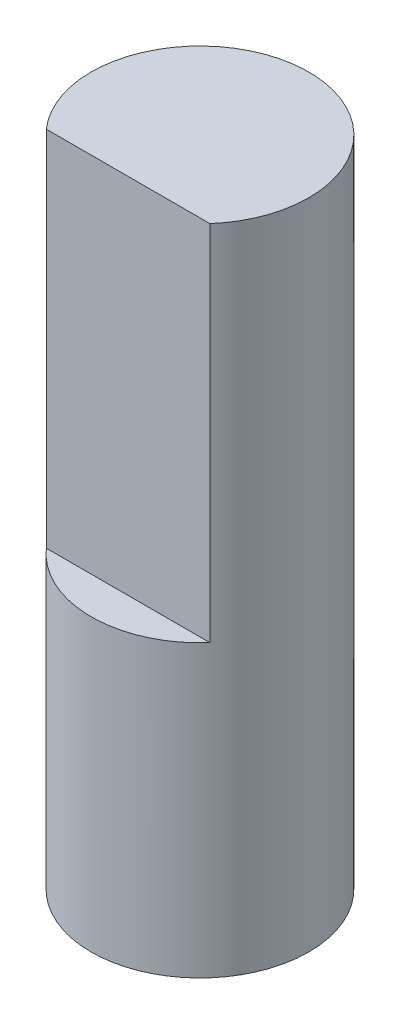
ISO-10303-21;
HEADER;
FILE_DESCRIPTION(('STEP AP214'),'2;1');
FILE_NAME('part.step','',(''),(''),'','','');
FILE_SCHEMA(('AUTOMOTIVE_DESIGN { 1 0 10303 214 1 1 1 1 }'));
ENDSEC;
DATA;
#1=APPLICATION_CONTEXT('core data for automotive mechanical design processes');
#2=APPLICATION_PROTOCOL_DEFINITION('international standard','automotive_design',2000,#1);
#3=PRODUCT_CONTEXT('',#1,'mechanical');
#4=PRODUCT('Part','Part','',(#3));
#5=PRODUCT_RELATED_PRODUCT_CATEGORY('part','',(#4));
#6=PRODUCT_DEFINITION_FORMATION('','',#4);
#7=PRODUCT_DEFINITION_CONTEXT('part definition',#1,'design');
#8=PRODUCT_DEFINITION('design','',#6,#7);
#9=PRODUCT_DEFINITION_SHAPE('','',#8);
#10=(LENGTH_UNIT() NAMED_UNIT(*) SI_UNIT(.MILLI.,.METRE.));
#11=(NAMED_UNIT(*) PLANE_ANGLE_UNIT() SI_UNIT($,.RADIAN.));
#12=(NAMED_UNIT(*) SI_UNIT($,.STERADIAN.) SOLID_ANGLE_UNIT());
#13=UNCERTAINTY_MEASURE_WITH_UNIT(LENGTH_MEASURE(1.E-05),#10,'distance_accuracy_value','');
#14=(GEOMETRIC_REPRESENTATION_CONTEXT(3) GLOBAL_UNCERTAINTY_ASSIGNED_CONTEXT((#13)) GLOBAL_UNIT_ASSIGNED_CONTEXT((#10,
#11,#12)) REPRESENTATION_CONTEXT('',''));
#15=CARTESIAN_POINT('',(0.,0.,0.));
#16=DIRECTION('',(0.,0.,1.));
#17=DIRECTION('',(1.,0.,0.));
#18=AXIS2_PLACEMENT_3D('',#15,#16,#17);
#19=CARTESIAN_POINT('',(0.,9.,0.));
#20=DIRECTION('',(0.,-1.,0.));
#21=DIRECTION('',(0.,0.,-1.));
#22=AXIS2_PLACEMENT_3D('',#19,#20,#21);
#23=CYLINDRICAL_SURFACE('',#22,1.5);
#24=CARTESIAN_POINT('',(0.,9.,0.));
#25=DIRECTION('',(0.,1.,0.));
#26=DIRECTION('',(0.,0.,1.));
#27=AXIS2_PLACEMENT_3D('',#24,#25,#26);
#28=CIRCLE('',#27,1.5);
#29=CARTESIAN_POINT('',(1.12642179624307,9.,0.990542243899035));
#30=VERTEX_POINT('',#29);
#31=CARTESIAN_POINT('',(-1.12642179624307,9.,0.990542243899035));
#32=VERTEX_POINT('',#31);
#33=EDGE_CURVE('E11',#30,#32,#28,.T.);
#34=ORIENTED_EDGE('',*,*,#33,.F.);
#35=DIRECTION('',(0.,1.,0.));
#36=VECTOR('',#35,1.);
#37=CARTESIAN_POINT('',(1.12642179624307,4.,0.990542243899035));
#38=LINE('',#37,#36);
#39=CARTESIAN_POINT('',(1.12642179624307,4.,0.990542243899035));
#40=VERTEX_POINT('',#39);
#41=EDGE_CURVE('E49',#40,#30,#38,.T.);
#42=ORIENTED_EDGE('',*,*,#41,.F.);
#43=CARTESIAN_POINT('',(0.,4.,0.));
#44=DIRECTION('',(0.,1.,0.));
#45=DIRECTION('',(0.,0.,1.));
#46=AXIS2_PLACEMENT_3D('',#43,#44,#45);
#47=CIRCLE('',#46,1.5);
#48=CARTESIAN_POINT('',(-1.12642179624307,4.,0.990542243899035));
#49=VERTEX_POINT('',#48);
#50=EDGE_CURVE('E64',#49,#40,#47,.T.);
#51=ORIENTED_EDGE('',*,*,#50,.F.);
#52=DIRECTION('',(0.,1.,0.));
#53=VECTOR('',#52,1.);
#54=CARTESIAN_POINT('',(-1.12642179624307,4.,0.990542243899035));
#55=LINE('',#54,#53);
#56=EDGE_CURVE('E55',#49,#32,#55,.T.);
#57=ORIENTED_EDGE('',*,*,#56,.T.);
#58=EDGE_LOOP('',(#34,#42,#51,#57));
#59=FACE_BOUND('',#58,.T.);
#60=CARTESIAN_POINT('',(0.,0.,0.));
#61=DIRECTION('',(0.,1.,0.));
#62=DIRECTION('',(0.,0.,1.));
#63=AXIS2_PLACEMENT_3D('',#60,#61,#62);
#64=CIRCLE('',#63,1.5);
#65=CARTESIAN_POINT('',(0.,0.,1.5));
#66=VERTEX_POINT('',#65);
#67=EDGE_CURVE('E38',#66,#66,#64,.T.);
#68=ORIENTED_EDGE('',*,*,#67,.T.);
#69=EDGE_LOOP('',(#68));
#70=FACE_BOUND('',#69,.T.);
#71=ADVANCED_FACE('F35',(#59,#70),#23,.T.);
#72=CARTESIAN_POINT('',(0.,9.,0.));
#73=DIRECTION('',(0.,1.,0.));
#74=DIRECTION('',(0.,0.,1.));
#75=AXIS2_PLACEMENT_3D('',#72,#73,#74);
#76=PLANE('',#75);
#77=DIRECTION('',(-1.,0.,0.));
#78=VECTOR('',#77,1.);
#79=CARTESIAN_POINT('',(-1.12642179624307,9.,0.990542243899035));
#80=LINE('',#79,#78);
#81=EDGE_CURVE('E60',#30,#32,#80,.T.);
#82=ORIENTED_EDGE('',*,*,#81,.F.);
#83=ORIENTED_EDGE('',*,*,#33,.T.);
#84=EDGE_LOOP('',(#82,#83));
#85=FACE_BOUND('',#84,.T.);
#86=ADVANCED_FACE('F70',(#85),#76,.T.);
#87=CARTESIAN_POINT('',(0.,0.,0.));
#88=DIRECTION('',(0.,1.,0.));
#89=DIRECTION('',(0.,0.,1.));
#90=AXIS2_PLACEMENT_3D('',#87,#88,#89);
#91=PLANE('',#90);
#92=ORIENTED_EDGE('',*,*,#67,.F.);
#93=EDGE_LOOP('',(#92));
#94=FACE_BOUND('',#93,.T.);
#95=ADVANCED_FACE('F72',(#94),#91,.F.);
#96=CARTESIAN_POINT('',(-1.12642179624307,4.,0.990542243899035));
#97=DIRECTION('',(0.,0.,-1.));
#98=DIRECTION('',(-1.,0.,0.));
#99=AXIS2_PLACEMENT_3D('',#96,#97,#98);
#100=PLANE('',#99);
#101=ORIENTED_EDGE('',*,*,#81,.T.);
#102=ORIENTED_EDGE('',*,*,#56,.F.);
#103=DIRECTION('',(-1.,0.,0.));
#104=VECTOR('',#103,1.);
#105=CARTESIAN_POINT('',(-1.12642179624307,4.,0.990542243899035));
#106=LINE('',#105,#104);
#107=EDGE_CURVE('E87',#40,#49,#106,.T.);
#108=ORIENTED_EDGE('',*,*,#107,.F.);
#109=ORIENTED_EDGE('',*,*,#41,.T.);
#110=EDGE_LOOP('',(#101,#102,#108,#109));
#111=FACE_BOUND('',#110,.T.);
#112=ADVANCED_FACE('F61',(#111),#100,.F.);
#113=CARTESIAN_POINT('',(0.,4.,0.));
#114=DIRECTION('',(0.,1.,0.));
#115=DIRECTION('',(0.,0.,1.));
#116=AXIS2_PLACEMENT_3D('',#113,#114,#115);
#117=PLANE('',#116);
#118=ORIENTED_EDGE('',*,*,#50,.T.);
#119=ORIENTED_EDGE('',*,*,#107,.T.);
#120=EDGE_LOOP('',(#118,#119));
#121=FACE_BOUND('',#120,.T.);
#122=ADVANCED_FACE('F82',(#121),#117,.T.);
#123=CLOSED_SHELL('',(#71,#86,#95,#112,#122));
#124=MANIFOLD_SOLID_BREP('B2',#123);
#125=ADVANCED_BREP_SHAPE_REPRESENTATION('',(#18,#124),#14);
#126=SHAPE_DEFINITION_REPRESENTATION(#9,#125);
ENDSEC;
END-ISO-10303-21;
